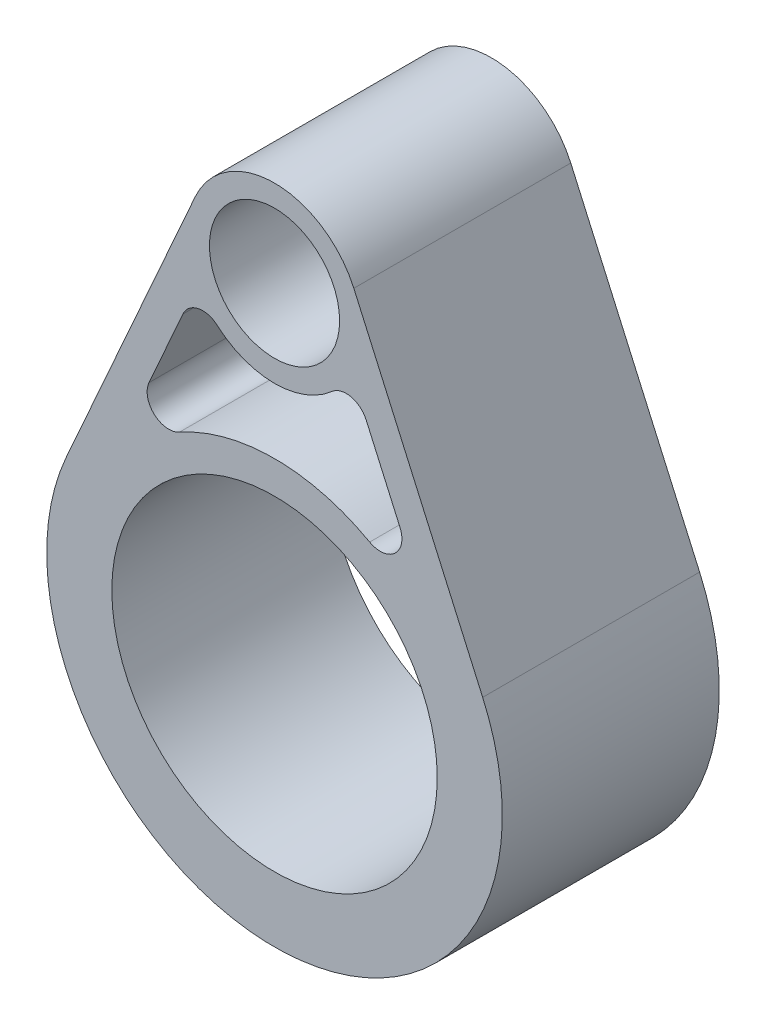
ISO-10303-21;
HEADER;
FILE_DESCRIPTION(('STEP AP214'),'2;1');
FILE_NAME('part.step','',(''),(''),'','','');
FILE_SCHEMA(('AUTOMOTIVE_DESIGN { 1 0 10303 214 1 1 1 1 }'));
ENDSEC;
DATA;
#1=APPLICATION_CONTEXT('core data for automotive mechanical design processes');
#2=APPLICATION_PROTOCOL_DEFINITION('international standard','automotive_design',2000,#1);
#3=PRODUCT_CONTEXT('',#1,'mechanical');
#4=PRODUCT('Part','Part','',(#3));
#5=PRODUCT_RELATED_PRODUCT_CATEGORY('part','',(#4));
#6=PRODUCT_DEFINITION_FORMATION('','',#4);
#7=PRODUCT_DEFINITION_CONTEXT('part definition',#1,'design');
#8=PRODUCT_DEFINITION('design','',#6,#7);
#9=PRODUCT_DEFINITION_SHAPE('','',#8);
#10=(LENGTH_UNIT() NAMED_UNIT(*) SI_UNIT(.MILLI.,.METRE.));
#11=(NAMED_UNIT(*) PLANE_ANGLE_UNIT() SI_UNIT($,.RADIAN.));
#12=(NAMED_UNIT(*) SI_UNIT($,.STERADIAN.) SOLID_ANGLE_UNIT());
#13=UNCERTAINTY_MEASURE_WITH_UNIT(LENGTH_MEASURE(1.E-05),#10,'distance_accuracy_value','');
#14=(GEOMETRIC_REPRESENTATION_CONTEXT(3) GLOBAL_UNCERTAINTY_ASSIGNED_CONTEXT((#13)) GLOBAL_UNIT_ASSIGNED_CONTEXT((#10,
#11,#12)) REPRESENTATION_CONTEXT('',''));
#15=CARTESIAN_POINT('',(0.,0.,0.));
#16=DIRECTION('',(0.,0.,1.));
#17=DIRECTION('',(1.,0.,0.));
#18=AXIS2_PLACEMENT_3D('',#15,#16,#17);
#19=CARTESIAN_POINT('',(0.,-160.,50.));
#20=DIRECTION('',(0.,0.,1.));
#21=DIRECTION('',(1.,0.,0.));
#22=AXIS2_PLACEMENT_3D('',#19,#20,#21);
#23=PLANE('',#22);
#24=CARTESIAN_POINT('',(0.,0.,50.));
#25=DIRECTION('',(0.,0.,1.));
#26=DIRECTION('',(1.,0.,0.));
#27=AXIS2_PLACEMENT_3D('',#24,#25,#26);
#28=CIRCLE('',#27,30.);
#29=CARTESIAN_POINT('',(30.,0.,50.));
#30=VERTEX_POINT('',#29);
#31=EDGE_CURVE('E286',#30,#30,#28,.T.);
#32=ORIENTED_EDGE('',*,*,#31,.F.);
#33=EDGE_LOOP('',(#32));
#34=FACE_BOUND('',#33,.T.);
#35=CARTESIAN_POINT('',(0.,0.,50.));
#36=DIRECTION('',(0.,0.,-1.));
#37=DIRECTION('',(1.,0.,0.));
#38=AXIS2_PLACEMENT_3D('',#35,#36,#37);
#39=CIRCLE('',#38,40.);
#40=CARTESIAN_POINT('',(26.4666556609354,-29.9919345512335,50.));
#41=VERTEX_POINT('',#40);
#42=CARTESIAN_POINT('',(-26.4666556609355,-29.9919345512335,50.));
#43=VERTEX_POINT('',#42);
#44=EDGE_CURVE('E193',#41,#43,#39,.T.);
#45=ORIENTED_EDGE('',*,*,#44,.F.);
#46=CARTESIAN_POINT('',(33.0833195761693,-37.4899181890419,50.));
#47=DIRECTION('',(0.,0.,1.));
#48=DIRECTION('',(1.,0.,0.));
#49=AXIS2_PLACEMENT_3D('',#46,#47,#48);
#50=CIRCLE('',#49,10.);
#51=CARTESIAN_POINT('',(42.2209392744277,-33.4274181890419,50.));
#52=VERTEX_POINT('',#51);
#53=EDGE_CURVE('E177',#41,#52,#50,.F.);
#54=ORIENTED_EDGE('',*,*,#53,.T.);
#55=DIRECTION('',(-0.40625,0.91376196982584,0.));
#56=VECTOR('',#55,1.);
#57=CARTESIAN_POINT('',(82.2385772843257,-123.4375,50.));
#58=LINE('',#57,#56);
#59=CARTESIAN_POINT('',(57.8635772843256,-68.6117818104496,50.));
#60=VERTEX_POINT('',#59);
#61=EDGE_CURVE('E293',#60,#52,#58,.T.);
#62=ORIENTED_EDGE('',*,*,#61,.F.);
#63=CARTESIAN_POINT('',(48.7259575860672,-72.6742818104496,50.));
#64=DIRECTION('',(0.,0.,1.));
#65=DIRECTION('',(1.,0.,0.));
#66=AXIS2_PLACEMENT_3D('',#63,#64,#65);
#67=CIRCLE('',#66,10.);
#68=CARTESIAN_POINT('',(43.8533618274605,-81.4068536294046,50.));
#69=VERTEX_POINT('',#68);
#70=EDGE_CURVE('E50',#60,#69,#67,.F.);
#71=ORIENTED_EDGE('',*,*,#70,.T.);
#72=CARTESIAN_POINT('',(0.,-160.,50.));
#73=DIRECTION('',(0.,0.,-1.));
#74=DIRECTION('',(1.,0.,0.));
#75=AXIS2_PLACEMENT_3D('',#72,#73,#74);
#76=CIRCLE('',#75,90.);
#77=CARTESIAN_POINT('',(-43.8533618274605,-81.4068536294046,50.));
#78=VERTEX_POINT('',#77);
#79=EDGE_CURVE('E187',#78,#69,#76,.T.);
#80=ORIENTED_EDGE('',*,*,#79,.F.);
#81=CARTESIAN_POINT('',(-48.7259575860672,-72.6742818104496,50.));
#82=DIRECTION('',(0.,0.,1.));
#83=DIRECTION('',(1.,0.,0.));
#84=AXIS2_PLACEMENT_3D('',#81,#82,#83);
#85=CIRCLE('',#84,10.);
#86=CARTESIAN_POINT('',(-57.8635772843256,-68.6117818104496,50.));
#87=VERTEX_POINT('',#86);
#88=EDGE_CURVE('E43',#78,#87,#85,.F.);
#89=ORIENTED_EDGE('',*,*,#88,.T.);
#90=DIRECTION('',(-0.40625,-0.91376196982584,0.));
#91=VECTOR('',#90,1.);
#92=CARTESIAN_POINT('',(-35.5292014298928,-18.3759583628748,50.));
#93=LINE('',#92,#91);
#94=CARTESIAN_POINT('',(-42.2209392744277,-33.4274181890419,50.));
#95=VERTEX_POINT('',#94);
#96=EDGE_CURVE('E186',#95,#87,#93,.T.);
#97=ORIENTED_EDGE('',*,*,#96,.F.);
#98=CARTESIAN_POINT('',(-33.0833195761693,-37.4899181890419,50.));
#99=DIRECTION('',(0.,0.,1.));
#100=DIRECTION('',(1.,0.,0.));
#101=AXIS2_PLACEMENT_3D('',#98,#99,#100);
#102=CIRCLE('',#101,10.);
#103=EDGE_CURVE('E173',#95,#43,#102,.F.);
#104=ORIENTED_EDGE('',*,*,#103,.T.);
#105=EDGE_LOOP('',(#45,#54,#62,#71,#80,#89,#97,#104));
#106=FACE_BOUND('',#105,.T.);
#107=CARTESIAN_POINT('',(0.,-160.,50.));
#108=DIRECTION('',(0.,0.,1.));
#109=DIRECTION('',(1.,0.,0.));
#110=AXIS2_PLACEMENT_3D('',#107,#108,#109);
#111=CIRCLE('',#110,105.);
#112=CARTESIAN_POINT('',(-95.9450068317132,-117.34375,50.));
#113=VERTEX_POINT('',#112);
#114=CARTESIAN_POINT('',(95.9450068317133,-117.34375,50.));
#115=VERTEX_POINT('',#114);
#116=EDGE_CURVE('E135',#113,#115,#111,.T.);
#117=ORIENTED_EDGE('',*,*,#116,.T.);
#118=DIRECTION('',(-0.40625,0.91376196982584,0.));
#119=VECTOR('',#118,1.);
#120=CARTESIAN_POINT('',(36.5504787930336,16.25,50.));
#121=LINE('',#120,#119);
#122=CARTESIAN_POINT('',(36.5504787930336,16.25,50.));
#123=VERTEX_POINT('',#122);
#124=EDGE_CURVE('E124',#115,#123,#121,.T.);
#125=ORIENTED_EDGE('',*,*,#124,.T.);
#126=CARTESIAN_POINT('',(0.,0.,50.));
#127=DIRECTION('',(0.,0.,1.));
#128=DIRECTION('',(1.,0.,0.));
#129=AXIS2_PLACEMENT_3D('',#126,#127,#128);
#130=CIRCLE('',#129,40.);
#131=CARTESIAN_POINT('',(-36.5504787930336,16.25,50.));
#132=VERTEX_POINT('',#131);
#133=EDGE_CURVE('E134',#123,#132,#130,.T.);
#134=ORIENTED_EDGE('',*,*,#133,.T.);
#135=DIRECTION('',(-0.40625,-0.91376196982584,0.));
#136=VECTOR('',#135,1.);
#137=CARTESIAN_POINT('',(-95.9450068317132,-117.34375,50.));
#138=LINE('',#137,#136);
#139=EDGE_CURVE('E140',#132,#113,#138,.T.);
#140=ORIENTED_EDGE('',*,*,#139,.T.);
#141=EDGE_LOOP('',(#117,#125,#134,#140));
#142=FACE_BOUND('',#141,.T.);
#143=CARTESIAN_POINT('',(0.,-160.,50.));
#144=DIRECTION('',(0.,0.,1.));
#145=DIRECTION('',(1.,0.,0.));
#146=AXIS2_PLACEMENT_3D('',#143,#144,#145);
#147=CIRCLE('',#146,75.);
#148=CARTESIAN_POINT('',(75.,-160.,50.));
#149=VERTEX_POINT('',#148);
#150=EDGE_CURVE('E216',#149,#149,#147,.T.);
#151=ORIENTED_EDGE('',*,*,#150,.F.);
#152=EDGE_LOOP('',(#151));
#153=FACE_BOUND('',#152,.T.);
#154=ADVANCED_FACE('F35',(#34,#106,#142,#153),#23,.T.);
#155=CARTESIAN_POINT('',(0.,-160.,-50.));
#156=DIRECTION('',(0.,0.,1.));
#157=DIRECTION('',(1.,0.,0.));
#158=AXIS2_PLACEMENT_3D('',#155,#156,#157);
#159=PLANE('',#158);
#160=CARTESIAN_POINT('',(0.,0.,-50.));
#161=DIRECTION('',(0.,0.,1.));
#162=DIRECTION('',(1.,0.,0.));
#163=AXIS2_PLACEMENT_3D('',#160,#161,#162);
#164=CIRCLE('',#163,30.);
#165=CARTESIAN_POINT('',(30.,0.,-50.));
#166=VERTEX_POINT('',#165);
#167=EDGE_CURVE('E284',#166,#166,#164,.T.);
#168=ORIENTED_EDGE('',*,*,#167,.T.);
#169=EDGE_LOOP('',(#168));
#170=FACE_BOUND('',#169,.T.);
#171=CARTESIAN_POINT('',(0.,-160.,-50.));
#172=DIRECTION('',(0.,0.,-1.));
#173=DIRECTION('',(1.,0.,0.));
#174=AXIS2_PLACEMENT_3D('',#171,#172,#173);
#175=CIRCLE('',#174,90.);
#176=CARTESIAN_POINT('',(-43.8533618274605,-81.4068536294046,-50.));
#177=VERTEX_POINT('',#176);
#178=CARTESIAN_POINT('',(43.8533618274605,-81.4068536294046,-50.));
#179=VERTEX_POINT('',#178);
#180=EDGE_CURVE('E201',#177,#179,#175,.T.);
#181=ORIENTED_EDGE('',*,*,#180,.T.);
#182=CARTESIAN_POINT('',(48.7259575860672,-72.6742818104496,-50.));
#183=DIRECTION('',(0.,0.,1.));
#184=DIRECTION('',(1.,0.,0.));
#185=AXIS2_PLACEMENT_3D('',#182,#183,#184);
#186=CIRCLE('',#185,10.);
#187=CARTESIAN_POINT('',(57.8635772843256,-68.6117818104496,-50.));
#188=VERTEX_POINT('',#187);
#189=EDGE_CURVE('E182',#179,#188,#186,.T.);
#190=ORIENTED_EDGE('',*,*,#189,.T.);
#191=DIRECTION('',(-0.40625,0.91376196982584,0.));
#192=VECTOR('',#191,1.);
#193=CARTESIAN_POINT('',(82.2385772843257,-123.4375,-50.));
#194=LINE('',#193,#192);
#195=CARTESIAN_POINT('',(42.2209392744277,-33.4274181890419,-50.));
#196=VERTEX_POINT('',#195);
#197=EDGE_CURVE('E207',#188,#196,#194,.T.);
#198=ORIENTED_EDGE('',*,*,#197,.T.);
#199=CARTESIAN_POINT('',(33.0833195761693,-37.4899181890419,-50.));
#200=DIRECTION('',(0.,0.,1.));
#201=DIRECTION('',(1.,0.,0.));
#202=AXIS2_PLACEMENT_3D('',#199,#200,#201);
#203=CIRCLE('',#202,10.);
#204=CARTESIAN_POINT('',(26.4666556609354,-29.9919345512335,-50.));
#205=VERTEX_POINT('',#204);
#206=EDGE_CURVE('E179',#196,#205,#203,.T.);
#207=ORIENTED_EDGE('',*,*,#206,.T.);
#208=CARTESIAN_POINT('',(0.,0.,-50.));
#209=DIRECTION('',(0.,0.,-1.));
#210=DIRECTION('',(1.,0.,0.));
#211=AXIS2_PLACEMENT_3D('',#208,#209,#210);
#212=CIRCLE('',#211,40.);
#213=CARTESIAN_POINT('',(-26.4666556609355,-29.9919345512335,-50.));
#214=VERTEX_POINT('',#213);
#215=EDGE_CURVE('E212',#205,#214,#212,.T.);
#216=ORIENTED_EDGE('',*,*,#215,.T.);
#217=CARTESIAN_POINT('',(-33.0833195761693,-37.4899181890419,-50.));
#218=DIRECTION('',(0.,0.,1.));
#219=DIRECTION('',(1.,0.,0.));
#220=AXIS2_PLACEMENT_3D('',#217,#218,#219);
#221=CIRCLE('',#220,10.);
#222=CARTESIAN_POINT('',(-42.2209392744277,-33.4274181890419,-50.));
#223=VERTEX_POINT('',#222);
#224=EDGE_CURVE('E175',#214,#223,#221,.T.);
#225=ORIENTED_EDGE('',*,*,#224,.T.);
#226=DIRECTION('',(-0.40625,-0.91376196982584,0.));
#227=VECTOR('',#226,1.);
#228=CARTESIAN_POINT('',(-35.5292014298928,-18.3759583628748,-50.));
#229=LINE('',#228,#227);
#230=CARTESIAN_POINT('',(-57.8635772843256,-68.6117818104496,-50.));
#231=VERTEX_POINT('',#230);
#232=EDGE_CURVE('E203',#223,#231,#229,.T.);
#233=ORIENTED_EDGE('',*,*,#232,.T.);
#234=CARTESIAN_POINT('',(-48.7259575860672,-72.6742818104496,-50.));
#235=DIRECTION('',(0.,0.,1.));
#236=DIRECTION('',(1.,0.,0.));
#237=AXIS2_PLACEMENT_3D('',#234,#235,#236);
#238=CIRCLE('',#237,10.);
#239=EDGE_CURVE('E11',#231,#177,#238,.T.);
#240=ORIENTED_EDGE('',*,*,#239,.T.);
#241=EDGE_LOOP('',(#181,#190,#198,#207,#216,#225,#233,#240));
#242=FACE_BOUND('',#241,.T.);
#243=CARTESIAN_POINT('',(0.,-160.,-50.));
#244=DIRECTION('',(0.,0.,1.));
#245=DIRECTION('',(1.,0.,0.));
#246=AXIS2_PLACEMENT_3D('',#243,#244,#245);
#247=CIRCLE('',#246,105.);
#248=CARTESIAN_POINT('',(-95.9450068317132,-117.34375,-50.));
#249=VERTEX_POINT('',#248);
#250=CARTESIAN_POINT('',(95.9450068317133,-117.34375,-50.));
#251=VERTEX_POINT('',#250);
#252=EDGE_CURVE('E148',#249,#251,#247,.T.);
#253=ORIENTED_EDGE('',*,*,#252,.F.);
#254=DIRECTION('',(-0.40625,-0.91376196982584,0.));
#255=VECTOR('',#254,1.);
#256=CARTESIAN_POINT('',(-95.9450068317132,-117.34375,-50.));
#257=LINE('',#256,#255);
#258=CARTESIAN_POINT('',(-36.5504787930336,16.25,-50.));
#259=VERTEX_POINT('',#258);
#260=EDGE_CURVE('E144',#259,#249,#257,.T.);
#261=ORIENTED_EDGE('',*,*,#260,.F.);
#262=CARTESIAN_POINT('',(0.,0.,-50.));
#263=DIRECTION('',(0.,0.,1.));
#264=DIRECTION('',(1.,0.,0.));
#265=AXIS2_PLACEMENT_3D('',#262,#263,#264);
#266=CIRCLE('',#265,40.);
#267=CARTESIAN_POINT('',(36.5504787930336,16.25,-50.));
#268=VERTEX_POINT('',#267);
#269=EDGE_CURVE('E227',#268,#259,#266,.T.);
#270=ORIENTED_EDGE('',*,*,#269,.F.);
#271=DIRECTION('',(-0.40625,0.91376196982584,0.));
#272=VECTOR('',#271,1.);
#273=CARTESIAN_POINT('',(36.5504787930336,16.25,-50.));
#274=LINE('',#273,#272);
#275=EDGE_CURVE('E225',#251,#268,#274,.T.);
#276=ORIENTED_EDGE('',*,*,#275,.F.);
#277=EDGE_LOOP('',(#253,#261,#270,#276));
#278=FACE_BOUND('',#277,.T.);
#279=CARTESIAN_POINT('',(0.,-160.,-50.));
#280=DIRECTION('',(0.,0.,1.));
#281=DIRECTION('',(1.,0.,0.));
#282=AXIS2_PLACEMENT_3D('',#279,#280,#281);
#283=CIRCLE('',#282,75.);
#284=CARTESIAN_POINT('',(75.,-160.,-50.));
#285=VERTEX_POINT('',#284);
#286=EDGE_CURVE('E210',#285,#285,#283,.T.);
#287=ORIENTED_EDGE('',*,*,#286,.T.);
#288=EDGE_LOOP('',(#287));
#289=FACE_BOUND('',#288,.T.);
#290=ADVANCED_FACE('F199',(#170,#242,#278,#289),#159,.F.);
#291=CARTESIAN_POINT('',(0.,-160.,50.));
#292=DIRECTION('',(0.,0.,-1.));
#293=DIRECTION('',(-1.,0.,0.));
#294=AXIS2_PLACEMENT_3D('',#291,#292,#293);
#295=CYLINDRICAL_SURFACE('',#294,105.);
#296=ORIENTED_EDGE('',*,*,#252,.T.);
#297=DIRECTION('',(0.,0.,-1.));
#298=VECTOR('',#297,1.);
#299=CARTESIAN_POINT('',(95.9450068317133,-117.34375,50.));
#300=LINE('',#299,#298);
#301=EDGE_CURVE('E128',#115,#251,#300,.T.);
#302=ORIENTED_EDGE('',*,*,#301,.F.);
#303=ORIENTED_EDGE('',*,*,#116,.F.);
#304=DIRECTION('',(0.,0.,-1.));
#305=VECTOR('',#304,1.);
#306=CARTESIAN_POINT('',(-95.9450068317132,-117.34375,50.));
#307=LINE('',#306,#305);
#308=EDGE_CURVE('E223',#113,#249,#307,.T.);
#309=ORIENTED_EDGE('',*,*,#308,.T.);
#310=EDGE_LOOP('',(#296,#302,#303,#309));
#311=FACE_BOUND('',#310,.T.);
#312=ADVANCED_FACE('F146',(#311),#295,.T.);
#313=CARTESIAN_POINT('',(36.5504787930336,16.25,50.));
#314=DIRECTION('',(-0.91376196982584,-0.40625,0.));
#315=DIRECTION('',(0.40625,-0.91376196982584,0.));
#316=AXIS2_PLACEMENT_3D('',#313,#314,#315);
#317=PLANE('',#316);
#318=ORIENTED_EDGE('',*,*,#275,.T.);
#319=DIRECTION('',(0.,0.,-1.));
#320=VECTOR('',#319,1.);
#321=CARTESIAN_POINT('',(36.5504787930336,16.25,50.));
#322=LINE('',#321,#320);
#323=EDGE_CURVE('E131',#123,#268,#322,.T.);
#324=ORIENTED_EDGE('',*,*,#323,.F.);
#325=ORIENTED_EDGE('',*,*,#124,.F.);
#326=ORIENTED_EDGE('',*,*,#301,.T.);
#327=EDGE_LOOP('',(#318,#324,#325,#326));
#328=FACE_BOUND('',#327,.T.);
#329=ADVANCED_FACE('F126',(#328),#317,.F.);
#330=CARTESIAN_POINT('',(0.,0.,50.));
#331=DIRECTION('',(0.,0.,-1.));
#332=DIRECTION('',(-1.,0.,0.));
#333=AXIS2_PLACEMENT_3D('',#330,#331,#332);
#334=CYLINDRICAL_SURFACE('',#333,40.);
#335=ORIENTED_EDGE('',*,*,#269,.T.);
#336=DIRECTION('',(0.,0.,-1.));
#337=VECTOR('',#336,1.);
#338=CARTESIAN_POINT('',(-36.5504787930336,16.25,50.));
#339=LINE('',#338,#337);
#340=EDGE_CURVE('E153',#132,#259,#339,.T.);
#341=ORIENTED_EDGE('',*,*,#340,.F.);
#342=ORIENTED_EDGE('',*,*,#133,.F.);
#343=ORIENTED_EDGE('',*,*,#323,.T.);
#344=EDGE_LOOP('',(#335,#341,#342,#343));
#345=FACE_BOUND('',#344,.T.);
#346=ADVANCED_FACE('F238',(#345),#334,.T.);
#347=CARTESIAN_POINT('',(-95.9450068317132,-117.34375,50.));
#348=DIRECTION('',(0.91376196982584,-0.40625,0.));
#349=DIRECTION('',(0.40625,0.91376196982584,0.));
#350=AXIS2_PLACEMENT_3D('',#347,#348,#349);
#351=PLANE('',#350);
#352=ORIENTED_EDGE('',*,*,#260,.T.);
#353=ORIENTED_EDGE('',*,*,#308,.F.);
#354=ORIENTED_EDGE('',*,*,#139,.F.);
#355=ORIENTED_EDGE('',*,*,#340,.T.);
#356=EDGE_LOOP('',(#352,#353,#354,#355));
#357=FACE_BOUND('',#356,.T.);
#358=ADVANCED_FACE('F234',(#357),#351,.F.);
#359=CARTESIAN_POINT('',(0.,-160.,50.));
#360=DIRECTION('',(0.,0.,-1.));
#361=DIRECTION('',(-1.,0.,0.));
#362=AXIS2_PLACEMENT_3D('',#359,#360,#361);
#363=CYLINDRICAL_SURFACE('',#362,75.);
#364=ORIENTED_EDGE('',*,*,#150,.T.);
#365=EDGE_LOOP('',(#364));
#366=FACE_BOUND('',#365,.T.);
#367=ORIENTED_EDGE('',*,*,#286,.F.);
#368=EDGE_LOOP('',(#367));
#369=FACE_BOUND('',#368,.T.);
#370=ADVANCED_FACE('F245',(#366,#369),#363,.F.);
#371=CARTESIAN_POINT('',(0.,0.,-50.));
#372=DIRECTION('',(0.,0.,1.));
#373=DIRECTION('',(1.,0.,0.));
#374=AXIS2_PLACEMENT_3D('',#371,#372,#373);
#375=CYLINDRICAL_SURFACE('',#374,40.);
#376=ORIENTED_EDGE('',*,*,#44,.T.);
#377=DIRECTION('',(0.,0.,1.));
#378=VECTOR('',#377,1.);
#379=CARTESIAN_POINT('',(-26.4666556609355,-29.9919345512335,-50.));
#380=LINE('',#379,#378);
#381=EDGE_CURVE('E162',#43,#214,#380,.F.);
#382=ORIENTED_EDGE('',*,*,#381,.T.);
#383=ORIENTED_EDGE('',*,*,#215,.F.);
#384=DIRECTION('',(0.,0.,1.));
#385=VECTOR('',#384,1.);
#386=CARTESIAN_POINT('',(26.4666556609354,-29.9919345512335,-50.));
#387=LINE('',#386,#385);
#388=EDGE_CURVE('E159',#205,#41,#387,.T.);
#389=ORIENTED_EDGE('',*,*,#388,.T.);
#390=EDGE_LOOP('',(#376,#382,#383,#389));
#391=FACE_BOUND('',#390,.T.);
#392=ADVANCED_FACE('F260',(#391),#375,.T.);
#393=CARTESIAN_POINT('',(82.2385772843257,-123.4375,-50.));
#394=DIRECTION('',(0.91376196982584,0.40625,0.));
#395=DIRECTION('',(-0.40625,0.91376196982584,0.));
#396=AXIS2_PLACEMENT_3D('',#393,#394,#395);
#397=PLANE('',#396);
#398=ORIENTED_EDGE('',*,*,#61,.T.);
#399=DIRECTION('',(0.,0.,-1.));
#400=VECTOR('',#399,1.);
#401=CARTESIAN_POINT('',(42.2209392744277,-33.4274181890419,-50.));
#402=LINE('',#401,#400);
#403=EDGE_CURVE('E167',#52,#196,#402,.T.);
#404=ORIENTED_EDGE('',*,*,#403,.T.);
#405=ORIENTED_EDGE('',*,*,#197,.F.);
#406=DIRECTION('',(0.,0.,-1.));
#407=VECTOR('',#406,1.);
#408=CARTESIAN_POINT('',(57.8635772843256,-68.6117818104496,50.));
#409=LINE('',#408,#407);
#410=EDGE_CURVE('E164',#188,#60,#409,.F.);
#411=ORIENTED_EDGE('',*,*,#410,.T.);
#412=EDGE_LOOP('',(#398,#404,#405,#411));
#413=FACE_BOUND('',#412,.T.);
#414=ADVANCED_FACE('F264',(#413),#397,.F.);
#415=CARTESIAN_POINT('',(0.,-160.,-50.));
#416=DIRECTION('',(0.,0.,1.));
#417=DIRECTION('',(1.,0.,0.));
#418=AXIS2_PLACEMENT_3D('',#415,#416,#417);
#419=CYLINDRICAL_SURFACE('',#418,90.);
#420=ORIENTED_EDGE('',*,*,#79,.T.);
#421=DIRECTION('',(0.,0.,1.));
#422=VECTOR('',#421,1.);
#423=CARTESIAN_POINT('',(43.8533618274605,-81.4068536294046,-50.));
#424=LINE('',#423,#422);
#425=EDGE_CURVE('E171',#69,#179,#424,.F.);
#426=ORIENTED_EDGE('',*,*,#425,.T.);
#427=ORIENTED_EDGE('',*,*,#180,.F.);
#428=DIRECTION('',(0.,0.,1.));
#429=VECTOR('',#428,1.);
#430=CARTESIAN_POINT('',(-43.8533618274605,-81.4068536294046,-50.));
#431=LINE('',#430,#429);
#432=EDGE_CURVE('E169',#177,#78,#431,.T.);
#433=ORIENTED_EDGE('',*,*,#432,.T.);
#434=EDGE_LOOP('',(#420,#426,#427,#433));
#435=FACE_BOUND('',#434,.T.);
#436=ADVANCED_FACE('F205',(#435),#419,.T.);
#437=CARTESIAN_POINT('',(-35.5292014298928,-18.3759583628748,-50.));
#438=DIRECTION('',(-0.91376196982584,0.40625,0.));
#439=DIRECTION('',(-0.40625,-0.91376196982584,0.));
#440=AXIS2_PLACEMENT_3D('',#437,#438,#439);
#441=PLANE('',#440);
#442=ORIENTED_EDGE('',*,*,#232,.F.);
#443=DIRECTION('',(0.,0.,-1.));
#444=VECTOR('',#443,1.);
#445=CARTESIAN_POINT('',(-42.2209392744277,-33.4274181890419,50.));
#446=LINE('',#445,#444);
#447=EDGE_CURVE('E151',#223,#95,#446,.F.);
#448=ORIENTED_EDGE('',*,*,#447,.T.);
#449=ORIENTED_EDGE('',*,*,#96,.T.);
#450=DIRECTION('',(0.,0.,-1.));
#451=VECTOR('',#450,1.);
#452=CARTESIAN_POINT('',(-57.8635772843256,-68.6117818104496,-50.));
#453=LINE('',#452,#451);
#454=EDGE_CURVE('E149',#87,#231,#453,.T.);
#455=ORIENTED_EDGE('',*,*,#454,.T.);
#456=EDGE_LOOP('',(#442,#448,#449,#455));
#457=FACE_BOUND('',#456,.T.);
#458=ADVANCED_FACE('F190',(#457),#441,.F.);
#459=CARTESIAN_POINT('',(-33.0833195761693,-37.4899181890419,-50.));
#460=DIRECTION('',(0.,0.,1.));
#461=DIRECTION('',(1.,0.,0.));
#462=AXIS2_PLACEMENT_3D('',#459,#460,#461);
#463=CYLINDRICAL_SURFACE('',#462,10.);
#464=ORIENTED_EDGE('',*,*,#224,.F.);
#465=ORIENTED_EDGE('',*,*,#381,.F.);
#466=ORIENTED_EDGE('',*,*,#103,.F.);
#467=ORIENTED_EDGE('',*,*,#447,.F.);
#468=EDGE_LOOP('',(#464,#465,#466,#467));
#469=FACE_BOUND('',#468,.T.);
#470=ADVANCED_FACE('F268',(#469),#463,.F.);
#471=CARTESIAN_POINT('',(33.0833195761693,-37.4899181890419,-50.));
#472=DIRECTION('',(0.,0.,1.));
#473=DIRECTION('',(1.,0.,0.));
#474=AXIS2_PLACEMENT_3D('',#471,#472,#473);
#475=CYLINDRICAL_SURFACE('',#474,10.);
#476=ORIENTED_EDGE('',*,*,#206,.F.);
#477=ORIENTED_EDGE('',*,*,#403,.F.);
#478=ORIENTED_EDGE('',*,*,#53,.F.);
#479=ORIENTED_EDGE('',*,*,#388,.F.);
#480=EDGE_LOOP('',(#476,#477,#478,#479));
#481=FACE_BOUND('',#480,.T.);
#482=ADVANCED_FACE('F303',(#481),#475,.F.);
#483=CARTESIAN_POINT('',(48.7259575860672,-72.6742818104496,-50.));
#484=DIRECTION('',(0.,0.,1.));
#485=DIRECTION('',(1.,0.,0.));
#486=AXIS2_PLACEMENT_3D('',#483,#484,#485);
#487=CYLINDRICAL_SURFACE('',#486,10.);
#488=ORIENTED_EDGE('',*,*,#189,.F.);
#489=ORIENTED_EDGE('',*,*,#425,.F.);
#490=ORIENTED_EDGE('',*,*,#70,.F.);
#491=ORIENTED_EDGE('',*,*,#410,.F.);
#492=EDGE_LOOP('',(#488,#489,#490,#491));
#493=FACE_BOUND('',#492,.T.);
#494=ADVANCED_FACE('F280',(#493),#487,.F.);
#495=CARTESIAN_POINT('',(-48.7259575860672,-72.6742818104496,-50.));
#496=DIRECTION('',(0.,0.,1.));
#497=DIRECTION('',(1.,0.,0.));
#498=AXIS2_PLACEMENT_3D('',#495,#496,#497);
#499=CYLINDRICAL_SURFACE('',#498,10.);
#500=ORIENTED_EDGE('',*,*,#239,.F.);
#501=ORIENTED_EDGE('',*,*,#454,.F.);
#502=ORIENTED_EDGE('',*,*,#88,.F.);
#503=ORIENTED_EDGE('',*,*,#432,.F.);
#504=EDGE_LOOP('',(#500,#501,#502,#503));
#505=FACE_BOUND('',#504,.T.);
#506=ADVANCED_FACE('F37',(#505),#499,.F.);
#507=CARTESIAN_POINT('',(0.,0.,-50.));
#508=DIRECTION('',(0.,0.,1.));
#509=DIRECTION('',(1.,0.,0.));
#510=AXIS2_PLACEMENT_3D('',#507,#508,#509);
#511=CYLINDRICAL_SURFACE('',#510,30.);
#512=ORIENTED_EDGE('',*,*,#167,.F.);
#513=EDGE_LOOP('',(#512));
#514=FACE_BOUND('',#513,.T.);
#515=ORIENTED_EDGE('',*,*,#31,.T.);
#516=EDGE_LOOP('',(#515));
#517=FACE_BOUND('',#516,.T.);
#518=ADVANCED_FACE('F274',(#514,#517),#511,.F.);
#519=CLOSED_SHELL('',(#154,#290,#312,#329,#346,#358,#370,#392,#414,#436,#458,#470,#482,#494,
#506,#518));
#520=MANIFOLD_SOLID_BREP('B2',#519);
#521=ADVANCED_BREP_SHAPE_REPRESENTATION('',(#18,#520),#14);
#522=SHAPE_DEFINITION_REPRESENTATION(#9,#521);
ENDSEC;
END-ISO-10303-21;
